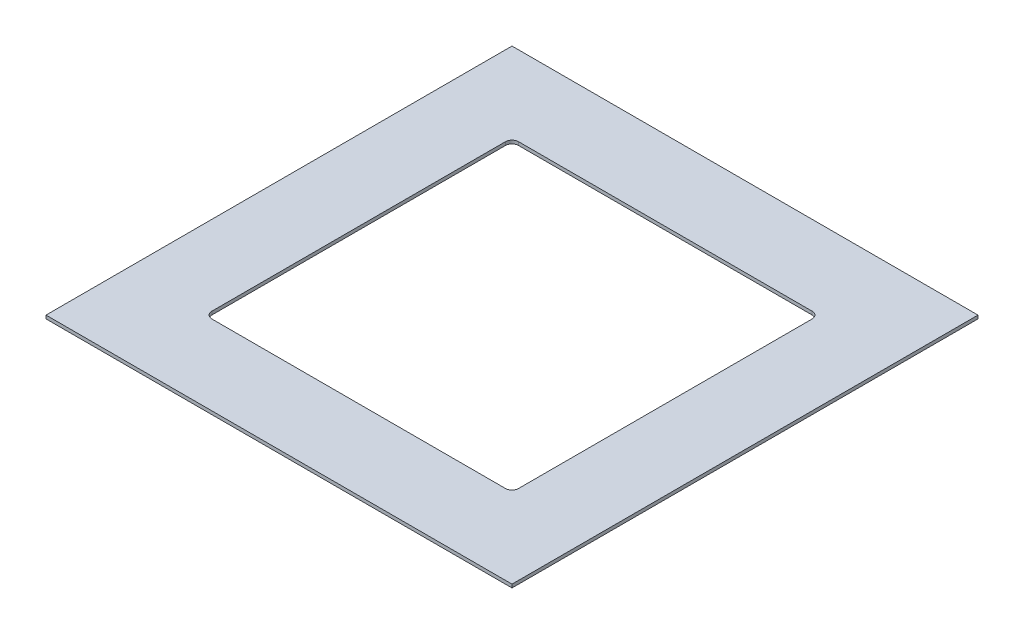
ISO-10303-21;
HEADER;
FILE_DESCRIPTION(('STEP AP214'),'2;1');
FILE_NAME('part.step','',(''),(''),'','','');
FILE_SCHEMA(('AUTOMOTIVE_DESIGN { 1 0 10303 214 1 1 1 1 }'));
ENDSEC;
DATA;
#1=APPLICATION_CONTEXT('core data for automotive mechanical design processes');
#2=APPLICATION_PROTOCOL_DEFINITION('international standard','automotive_design',2000,#1);
#3=PRODUCT_CONTEXT('',#1,'mechanical');
#4=PRODUCT('Part','Part','',(#3));
#5=PRODUCT_RELATED_PRODUCT_CATEGORY('part','',(#4));
#6=PRODUCT_DEFINITION_FORMATION('','',#4);
#7=PRODUCT_DEFINITION_CONTEXT('part definition',#1,'design');
#8=PRODUCT_DEFINITION('design','',#6,#7);
#9=PRODUCT_DEFINITION_SHAPE('','',#8);
#10=(LENGTH_UNIT() NAMED_UNIT(*) SI_UNIT(.MILLI.,.METRE.));
#11=(NAMED_UNIT(*) PLANE_ANGLE_UNIT() SI_UNIT($,.RADIAN.));
#12=(NAMED_UNIT(*) SI_UNIT($,.STERADIAN.) SOLID_ANGLE_UNIT());
#13=UNCERTAINTY_MEASURE_WITH_UNIT(LENGTH_MEASURE(1.E-05),#10,'distance_accuracy_value','');
#14=(GEOMETRIC_REPRESENTATION_CONTEXT(3) GLOBAL_UNCERTAINTY_ASSIGNED_CONTEXT((#13)) GLOBAL_UNIT_ASSIGNED_CONTEXT((#10,
#11,#12)) REPRESENTATION_CONTEXT('',''));
#15=CARTESIAN_POINT('',(0.,0.,0.));
#16=DIRECTION('',(0.,0.,1.));
#17=DIRECTION('',(1.,0.,0.));
#18=AXIS2_PLACEMENT_3D('',#15,#16,#17);
#19=CARTESIAN_POINT('',(0.,0.5,0.));
#20=DIRECTION('',(0.,-1.,0.));
#21=DIRECTION('',(0.,0.,-1.));
#22=AXIS2_PLACEMENT_3D('',#19,#20,#21);
#23=PLANE('',#22);
#24=DIRECTION('',(0.,0.,-1.));
#25=VECTOR('',#24,1.);
#26=CARTESIAN_POINT('',(69.85,0.5,69.85));
#27=LINE('',#26,#25);
#28=CARTESIAN_POINT('',(69.85,0.5,69.85));
#29=VERTEX_POINT('',#28);
#30=CARTESIAN_POINT('',(69.85,0.5,-69.85));
#31=VERTEX_POINT('',#30);
#32=EDGE_CURVE('E133',#29,#31,#27,.T.);
#33=ORIENTED_EDGE('',*,*,#32,.T.);
#34=DIRECTION('',(-1.,0.,0.));
#35=VECTOR('',#34,1.);
#36=CARTESIAN_POINT('',(-69.85,0.5,-69.85));
#37=LINE('',#36,#35);
#38=CARTESIAN_POINT('',(-69.85,0.5,-69.85));
#39=VERTEX_POINT('',#38);
#40=EDGE_CURVE('E122',#31,#39,#37,.T.);
#41=ORIENTED_EDGE('',*,*,#40,.T.);
#42=DIRECTION('',(0.,0.,1.));
#43=VECTOR('',#42,1.);
#44=CARTESIAN_POINT('',(-69.85,0.5,69.85));
#45=LINE('',#44,#43);
#46=CARTESIAN_POINT('',(-69.85,0.5,69.85));
#47=VERTEX_POINT('',#46);
#48=EDGE_CURVE('E132',#39,#47,#45,.T.);
#49=ORIENTED_EDGE('',*,*,#48,.T.);
#50=DIRECTION('',(1.,0.,0.));
#51=VECTOR('',#50,1.);
#52=CARTESIAN_POINT('',(-69.85,0.5,69.85));
#53=LINE('',#52,#51);
#54=EDGE_CURVE('E137',#47,#29,#53,.T.);
#55=ORIENTED_EDGE('',*,*,#54,.T.);
#56=EDGE_LOOP('',(#33,#41,#49,#55));
#57=FACE_BOUND('',#56,.T.);
#58=DIRECTION('',(0.,0.,-1.));
#59=VECTOR('',#58,1.);
#60=CARTESIAN_POINT('',(46.,0.5,46.));
#61=LINE('',#60,#59);
#62=CARTESIAN_POINT('',(46.,0.5,44.));
#63=VERTEX_POINT('',#62);
#64=CARTESIAN_POINT('',(46.,0.5,-44.));
#65=VERTEX_POINT('',#64);
#66=EDGE_CURVE('E201',#63,#65,#61,.T.);
#67=ORIENTED_EDGE('',*,*,#66,.F.);
#68=CARTESIAN_POINT('',(44.,0.5,44.));
#69=DIRECTION('',(0.,-1.,0.));
#70=DIRECTION('',(0.,0.,-1.));
#71=AXIS2_PLACEMENT_3D('',#68,#69,#70);
#72=CIRCLE('',#71,2.);
#73=CARTESIAN_POINT('',(44.,0.5,46.));
#74=VERTEX_POINT('',#73);
#75=EDGE_CURVE('E176',#63,#74,#72,.T.);
#76=ORIENTED_EDGE('',*,*,#75,.T.);
#77=DIRECTION('',(1.,0.,0.));
#78=VECTOR('',#77,1.);
#79=CARTESIAN_POINT('',(-46.,0.5,46.));
#80=LINE('',#79,#78);
#81=CARTESIAN_POINT('',(-44.,0.5,46.));
#82=VERTEX_POINT('',#81);
#83=EDGE_CURVE('E203',#82,#74,#80,.T.);
#84=ORIENTED_EDGE('',*,*,#83,.F.);
#85=CARTESIAN_POINT('',(-44.,0.5,44.));
#86=DIRECTION('',(0.,-1.,0.));
#87=DIRECTION('',(0.,0.,-1.));
#88=AXIS2_PLACEMENT_3D('',#85,#86,#87);
#89=CIRCLE('',#88,2.);
#90=CARTESIAN_POINT('',(-46.,0.5,44.));
#91=VERTEX_POINT('',#90);
#92=EDGE_CURVE('E172',#82,#91,#89,.T.);
#93=ORIENTED_EDGE('',*,*,#92,.T.);
#94=DIRECTION('',(0.,0.,1.));
#95=VECTOR('',#94,1.);
#96=CARTESIAN_POINT('',(-46.,0.5,46.));
#97=LINE('',#96,#95);
#98=CARTESIAN_POINT('',(-46.,0.5,-44.));
#99=VERTEX_POINT('',#98);
#100=EDGE_CURVE('E200',#99,#91,#97,.T.);
#101=ORIENTED_EDGE('',*,*,#100,.F.);
#102=CARTESIAN_POINT('',(-44.,0.5,-44.));
#103=DIRECTION('',(0.,-1.,0.));
#104=DIRECTION('',(0.,0.,-1.));
#105=AXIS2_PLACEMENT_3D('',#102,#103,#104);
#106=CIRCLE('',#105,2.);
#107=CARTESIAN_POINT('',(-44.,0.5,-46.));
#108=VERTEX_POINT('',#107);
#109=EDGE_CURVE('E11',#99,#108,#106,.T.);
#110=ORIENTED_EDGE('',*,*,#109,.T.);
#111=DIRECTION('',(-1.,0.,0.));
#112=VECTOR('',#111,1.);
#113=CARTESIAN_POINT('',(-46.,0.5,-46.));
#114=LINE('',#113,#112);
#115=CARTESIAN_POINT('',(44.,0.5,-46.));
#116=VERTEX_POINT('',#115);
#117=EDGE_CURVE('E198',#116,#108,#114,.T.);
#118=ORIENTED_EDGE('',*,*,#117,.F.);
#119=CARTESIAN_POINT('',(44.,0.5,-44.));
#120=DIRECTION('',(0.,-1.,0.));
#121=DIRECTION('',(0.,0.,-1.));
#122=AXIS2_PLACEMENT_3D('',#119,#120,#121);
#123=CIRCLE('',#122,2.);
#124=EDGE_CURVE('E180',#116,#65,#123,.T.);
#125=ORIENTED_EDGE('',*,*,#124,.T.);
#126=EDGE_LOOP('',(#67,#76,#84,#93,#101,#110,#118,#125));
#127=FACE_BOUND('',#126,.T.);
#128=ADVANCED_FACE('F33',(#57,#127),#23,.F.);
#129=CARTESIAN_POINT('',(0.,-0.5,0.));
#130=DIRECTION('',(0.,-1.,0.));
#131=DIRECTION('',(0.,0.,-1.));
#132=AXIS2_PLACEMENT_3D('',#129,#130,#131);
#133=PLANE('',#132);
#134=DIRECTION('',(0.,0.,-1.));
#135=VECTOR('',#134,1.);
#136=CARTESIAN_POINT('',(69.85,-0.5,69.85));
#137=LINE('',#136,#135);
#138=CARTESIAN_POINT('',(69.85,-0.5,69.85));
#139=VERTEX_POINT('',#138);
#140=CARTESIAN_POINT('',(69.85,-0.5,-69.85));
#141=VERTEX_POINT('',#140);
#142=EDGE_CURVE('E145',#139,#141,#137,.T.);
#143=ORIENTED_EDGE('',*,*,#142,.F.);
#144=DIRECTION('',(1.,0.,0.));
#145=VECTOR('',#144,1.);
#146=CARTESIAN_POINT('',(-69.85,-0.5,69.85));
#147=LINE('',#146,#145);
#148=CARTESIAN_POINT('',(-69.85,-0.5,69.85));
#149=VERTEX_POINT('',#148);
#150=EDGE_CURVE('E141',#149,#139,#147,.T.);
#151=ORIENTED_EDGE('',*,*,#150,.F.);
#152=DIRECTION('',(0.,0.,1.));
#153=VECTOR('',#152,1.);
#154=CARTESIAN_POINT('',(-69.85,-0.5,69.85));
#155=LINE('',#154,#153);
#156=CARTESIAN_POINT('',(-69.85,-0.5,-69.85));
#157=VERTEX_POINT('',#156);
#158=EDGE_CURVE('E222',#157,#149,#155,.T.);
#159=ORIENTED_EDGE('',*,*,#158,.F.);
#160=DIRECTION('',(-1.,0.,0.));
#161=VECTOR('',#160,1.);
#162=CARTESIAN_POINT('',(-69.85,-0.5,-69.85));
#163=LINE('',#162,#161);
#164=EDGE_CURVE('E220',#141,#157,#163,.T.);
#165=ORIENTED_EDGE('',*,*,#164,.F.);
#166=EDGE_LOOP('',(#143,#151,#159,#165));
#167=FACE_BOUND('',#166,.T.);
#168=DIRECTION('',(0.,0.,1.));
#169=VECTOR('',#168,1.);
#170=CARTESIAN_POINT('',(-46.,-0.5,46.));
#171=LINE('',#170,#169);
#172=CARTESIAN_POINT('',(-46.,-0.5,-44.));
#173=VERTEX_POINT('',#172);
#174=CARTESIAN_POINT('',(-46.,-0.5,44.));
#175=VERTEX_POINT('',#174);
#176=EDGE_CURVE('E186',#173,#175,#171,.T.);
#177=ORIENTED_EDGE('',*,*,#176,.T.);
#178=CARTESIAN_POINT('',(-44.,-0.5,44.));
#179=DIRECTION('',(0.,-1.,0.));
#180=DIRECTION('',(0.,0.,-1.));
#181=AXIS2_PLACEMENT_3D('',#178,#179,#180);
#182=CIRCLE('',#181,2.);
#183=CARTESIAN_POINT('',(-44.,-0.5,46.));
#184=VERTEX_POINT('',#183);
#185=EDGE_CURVE('E170',#175,#184,#182,.F.);
#186=ORIENTED_EDGE('',*,*,#185,.T.);
#187=DIRECTION('',(1.,0.,0.));
#188=VECTOR('',#187,1.);
#189=CARTESIAN_POINT('',(-46.,-0.5,46.));
#190=LINE('',#189,#188);
#191=CARTESIAN_POINT('',(44.,-0.5,46.));
#192=VERTEX_POINT('',#191);
#193=EDGE_CURVE('E195',#184,#192,#190,.T.);
#194=ORIENTED_EDGE('',*,*,#193,.T.);
#195=CARTESIAN_POINT('',(44.,-0.5,44.));
#196=DIRECTION('',(0.,-1.,0.));
#197=DIRECTION('',(0.,0.,-1.));
#198=AXIS2_PLACEMENT_3D('',#195,#196,#197);
#199=CIRCLE('',#198,2.);
#200=CARTESIAN_POINT('',(46.,-0.5,44.));
#201=VERTEX_POINT('',#200);
#202=EDGE_CURVE('E174',#192,#201,#199,.F.);
#203=ORIENTED_EDGE('',*,*,#202,.T.);
#204=DIRECTION('',(0.,0.,-1.));
#205=VECTOR('',#204,1.);
#206=CARTESIAN_POINT('',(46.,-0.5,46.));
#207=LINE('',#206,#205);
#208=CARTESIAN_POINT('',(46.,-0.5,-44.));
#209=VERTEX_POINT('',#208);
#210=EDGE_CURVE('E210',#201,#209,#207,.T.);
#211=ORIENTED_EDGE('',*,*,#210,.T.);
#212=CARTESIAN_POINT('',(44.,-0.5,-44.));
#213=DIRECTION('',(0.,-1.,0.));
#214=DIRECTION('',(0.,0.,-1.));
#215=AXIS2_PLACEMENT_3D('',#212,#213,#214);
#216=CIRCLE('',#215,2.);
#217=CARTESIAN_POINT('',(44.,-0.5,-46.));
#218=VERTEX_POINT('',#217);
#219=EDGE_CURVE('E178',#209,#218,#216,.F.);
#220=ORIENTED_EDGE('',*,*,#219,.T.);
#221=DIRECTION('',(-1.,0.,0.));
#222=VECTOR('',#221,1.);
#223=CARTESIAN_POINT('',(-46.,-0.5,-46.));
#224=LINE('',#223,#222);
#225=CARTESIAN_POINT('',(-44.,-0.5,-46.));
#226=VERTEX_POINT('',#225);
#227=EDGE_CURVE('E187',#218,#226,#224,.T.);
#228=ORIENTED_EDGE('',*,*,#227,.T.);
#229=CARTESIAN_POINT('',(-44.,-0.5,-44.));
#230=DIRECTION('',(0.,-1.,0.));
#231=DIRECTION('',(0.,0.,-1.));
#232=AXIS2_PLACEMENT_3D('',#229,#230,#231);
#233=CIRCLE('',#232,2.);
#234=EDGE_CURVE('E41',#226,#173,#233,.F.);
#235=ORIENTED_EDGE('',*,*,#234,.T.);
#236=EDGE_LOOP('',(#177,#186,#194,#203,#211,#220,#228,#235));
#237=FACE_BOUND('',#236,.T.);
#238=ADVANCED_FACE('F185',(#167,#237),#133,.T.);
#239=CARTESIAN_POINT('',(69.85,0.5,69.85));
#240=DIRECTION('',(-1.,0.,0.));
#241=DIRECTION('',(0.,0.,1.));
#242=AXIS2_PLACEMENT_3D('',#239,#240,#241);
#243=PLANE('',#242);
#244=ORIENTED_EDGE('',*,*,#142,.T.);
#245=DIRECTION('',(0.,-1.,0.));
#246=VECTOR('',#245,1.);
#247=CARTESIAN_POINT('',(69.85,0.5,-69.85));
#248=LINE('',#247,#246);
#249=EDGE_CURVE('E126',#31,#141,#248,.T.);
#250=ORIENTED_EDGE('',*,*,#249,.F.);
#251=ORIENTED_EDGE('',*,*,#32,.F.);
#252=DIRECTION('',(0.,-1.,0.));
#253=VECTOR('',#252,1.);
#254=CARTESIAN_POINT('',(69.85,0.5,69.85));
#255=LINE('',#254,#253);
#256=EDGE_CURVE('E218',#29,#139,#255,.T.);
#257=ORIENTED_EDGE('',*,*,#256,.T.);
#258=EDGE_LOOP('',(#244,#250,#251,#257));
#259=FACE_BOUND('',#258,.T.);
#260=ADVANCED_FACE('F143',(#259),#243,.F.);
#261=CARTESIAN_POINT('',(-69.85,0.5,-69.85));
#262=DIRECTION('',(0.,0.,1.));
#263=DIRECTION('',(1.,0.,0.));
#264=AXIS2_PLACEMENT_3D('',#261,#262,#263);
#265=PLANE('',#264);
#266=ORIENTED_EDGE('',*,*,#164,.T.);
#267=DIRECTION('',(0.,-1.,0.));
#268=VECTOR('',#267,1.);
#269=CARTESIAN_POINT('',(-69.85,0.5,-69.85));
#270=LINE('',#269,#268);
#271=EDGE_CURVE('E129',#39,#157,#270,.T.);
#272=ORIENTED_EDGE('',*,*,#271,.F.);
#273=ORIENTED_EDGE('',*,*,#40,.F.);
#274=ORIENTED_EDGE('',*,*,#249,.T.);
#275=EDGE_LOOP('',(#266,#272,#273,#274));
#276=FACE_BOUND('',#275,.T.);
#277=ADVANCED_FACE('F124',(#276),#265,.F.);
#278=CARTESIAN_POINT('',(-69.85,0.5,69.85));
#279=DIRECTION('',(1.,0.,0.));
#280=DIRECTION('',(0.,0.,-1.));
#281=AXIS2_PLACEMENT_3D('',#278,#279,#280);
#282=PLANE('',#281);
#283=ORIENTED_EDGE('',*,*,#158,.T.);
#284=DIRECTION('',(0.,-1.,0.));
#285=VECTOR('',#284,1.);
#286=CARTESIAN_POINT('',(-69.85,0.5,69.85));
#287=LINE('',#286,#285);
#288=EDGE_CURVE('E150',#47,#149,#287,.T.);
#289=ORIENTED_EDGE('',*,*,#288,.F.);
#290=ORIENTED_EDGE('',*,*,#48,.F.);
#291=ORIENTED_EDGE('',*,*,#271,.T.);
#292=EDGE_LOOP('',(#283,#289,#290,#291));
#293=FACE_BOUND('',#292,.T.);
#294=ADVANCED_FACE('F233',(#293),#282,.F.);
#295=CARTESIAN_POINT('',(-69.85,0.5,69.85));
#296=DIRECTION('',(0.,0.,-1.));
#297=DIRECTION('',(-1.,0.,0.));
#298=AXIS2_PLACEMENT_3D('',#295,#296,#297);
#299=PLANE('',#298);
#300=ORIENTED_EDGE('',*,*,#150,.T.);
#301=ORIENTED_EDGE('',*,*,#256,.F.);
#302=ORIENTED_EDGE('',*,*,#54,.F.);
#303=ORIENTED_EDGE('',*,*,#288,.T.);
#304=EDGE_LOOP('',(#300,#301,#302,#303));
#305=FACE_BOUND('',#304,.T.);
#306=ADVANCED_FACE('F229',(#305),#299,.F.);
#307=CARTESIAN_POINT('',(46.,0.5,46.));
#308=DIRECTION('',(-1.,0.,0.));
#309=DIRECTION('',(0.,0.,1.));
#310=AXIS2_PLACEMENT_3D('',#307,#308,#309);
#311=PLANE('',#310);
#312=ORIENTED_EDGE('',*,*,#210,.F.);
#313=DIRECTION('',(0.,-1.,0.));
#314=VECTOR('',#313,1.);
#315=CARTESIAN_POINT('',(46.,0.5,44.));
#316=LINE('',#315,#314);
#317=EDGE_CURVE('E164',#201,#63,#316,.F.);
#318=ORIENTED_EDGE('',*,*,#317,.T.);
#319=ORIENTED_EDGE('',*,*,#66,.T.);
#320=DIRECTION('',(0.,-1.,0.));
#321=VECTOR('',#320,1.);
#322=CARTESIAN_POINT('',(46.,-0.5,-44.));
#323=LINE('',#322,#321);
#324=EDGE_CURVE('E161',#65,#209,#323,.T.);
#325=ORIENTED_EDGE('',*,*,#324,.T.);
#326=EDGE_LOOP('',(#312,#318,#319,#325));
#327=FACE_BOUND('',#326,.T.);
#328=ADVANCED_FACE('F240',(#327),#311,.T.);
#329=CARTESIAN_POINT('',(-46.,0.5,-46.));
#330=DIRECTION('',(0.,0.,1.));
#331=DIRECTION('',(1.,0.,0.));
#332=AXIS2_PLACEMENT_3D('',#329,#330,#331);
#333=PLANE('',#332);
#334=ORIENTED_EDGE('',*,*,#227,.F.);
#335=DIRECTION('',(0.,-1.,0.));
#336=VECTOR('',#335,1.);
#337=CARTESIAN_POINT('',(44.,0.5,-46.));
#338=LINE('',#337,#336);
#339=EDGE_CURVE('E53',#218,#116,#338,.F.);
#340=ORIENTED_EDGE('',*,*,#339,.T.);
#341=ORIENTED_EDGE('',*,*,#117,.T.);
#342=DIRECTION('',(0.,-1.,0.));
#343=VECTOR('',#342,1.);
#344=CARTESIAN_POINT('',(-44.,-0.5,-46.));
#345=LINE('',#344,#343);
#346=EDGE_CURVE('E166',#108,#226,#345,.T.);
#347=ORIENTED_EDGE('',*,*,#346,.T.);
#348=EDGE_LOOP('',(#334,#340,#341,#347));
#349=FACE_BOUND('',#348,.T.);
#350=ADVANCED_FACE('F197',(#349),#333,.T.);
#351=CARTESIAN_POINT('',(-46.,0.5,46.));
#352=DIRECTION('',(1.,0.,0.));
#353=DIRECTION('',(0.,0.,-1.));
#354=AXIS2_PLACEMENT_3D('',#351,#352,#353);
#355=PLANE('',#354);
#356=ORIENTED_EDGE('',*,*,#100,.T.);
#357=DIRECTION('',(0.,-1.,0.));
#358=VECTOR('',#357,1.);
#359=CARTESIAN_POINT('',(-46.,-0.5,44.));
#360=LINE('',#359,#358);
#361=EDGE_CURVE('E148',#91,#175,#360,.T.);
#362=ORIENTED_EDGE('',*,*,#361,.T.);
#363=ORIENTED_EDGE('',*,*,#176,.F.);
#364=DIRECTION('',(0.,-1.,0.));
#365=VECTOR('',#364,1.);
#366=CARTESIAN_POINT('',(-46.,0.5,-44.));
#367=LINE('',#366,#365);
#368=EDGE_CURVE('E146',#173,#99,#367,.F.);
#369=ORIENTED_EDGE('',*,*,#368,.T.);
#370=EDGE_LOOP('',(#356,#362,#363,#369));
#371=FACE_BOUND('',#370,.T.);
#372=ADVANCED_FACE('F193',(#371),#355,.T.);
#373=CARTESIAN_POINT('',(-46.,0.5,46.));
#374=DIRECTION('',(0.,0.,-1.));
#375=DIRECTION('',(-1.,0.,0.));
#376=AXIS2_PLACEMENT_3D('',#373,#374,#375);
#377=PLANE('',#376);
#378=ORIENTED_EDGE('',*,*,#193,.F.);
#379=DIRECTION('',(0.,-1.,0.));
#380=VECTOR('',#379,1.);
#381=CARTESIAN_POINT('',(-44.,0.5,46.));
#382=LINE('',#381,#380);
#383=EDGE_CURVE('E159',#184,#82,#382,.F.);
#384=ORIENTED_EDGE('',*,*,#383,.T.);
#385=ORIENTED_EDGE('',*,*,#83,.T.);
#386=DIRECTION('',(0.,-1.,0.));
#387=VECTOR('',#386,1.);
#388=CARTESIAN_POINT('',(44.,-0.5,46.));
#389=LINE('',#388,#387);
#390=EDGE_CURVE('E156',#74,#192,#389,.T.);
#391=ORIENTED_EDGE('',*,*,#390,.T.);
#392=EDGE_LOOP('',(#378,#384,#385,#391));
#393=FACE_BOUND('',#392,.T.);
#394=ADVANCED_FACE('F257',(#393),#377,.T.);
#395=CARTESIAN_POINT('',(-44.,0.5,44.));
#396=DIRECTION('',(0.,1.,0.));
#397=DIRECTION('',(0.,0.,1.));
#398=AXIS2_PLACEMENT_3D('',#395,#396,#397);
#399=CYLINDRICAL_SURFACE('',#398,2.);
#400=ORIENTED_EDGE('',*,*,#92,.F.);
#401=ORIENTED_EDGE('',*,*,#383,.F.);
#402=ORIENTED_EDGE('',*,*,#185,.F.);
#403=ORIENTED_EDGE('',*,*,#361,.F.);
#404=EDGE_LOOP('',(#400,#401,#402,#403));
#405=FACE_BOUND('',#404,.T.);
#406=ADVANCED_FACE('F259',(#405),#399,.F.);
#407=CARTESIAN_POINT('',(44.,0.5,44.));
#408=DIRECTION('',(0.,1.,0.));
#409=DIRECTION('',(0.,0.,1.));
#410=AXIS2_PLACEMENT_3D('',#407,#408,#409);
#411=CYLINDRICAL_SURFACE('',#410,2.);
#412=ORIENTED_EDGE('',*,*,#75,.F.);
#413=ORIENTED_EDGE('',*,*,#317,.F.);
#414=ORIENTED_EDGE('',*,*,#202,.F.);
#415=ORIENTED_EDGE('',*,*,#390,.F.);
#416=EDGE_LOOP('',(#412,#413,#414,#415));
#417=FACE_BOUND('',#416,.T.);
#418=ADVANCED_FACE('F264',(#417),#411,.F.);
#419=CARTESIAN_POINT('',(44.,0.5,-44.));
#420=DIRECTION('',(0.,1.,0.));
#421=DIRECTION('',(0.,0.,1.));
#422=AXIS2_PLACEMENT_3D('',#419,#420,#421);
#423=CYLINDRICAL_SURFACE('',#422,2.);
#424=ORIENTED_EDGE('',*,*,#124,.F.);
#425=ORIENTED_EDGE('',*,*,#339,.F.);
#426=ORIENTED_EDGE('',*,*,#219,.F.);
#427=ORIENTED_EDGE('',*,*,#324,.F.);
#428=EDGE_LOOP('',(#424,#425,#426,#427));
#429=FACE_BOUND('',#428,.T.);
#430=ADVANCED_FACE('F279',(#429),#423,.F.);
#431=CARTESIAN_POINT('',(-44.,0.5,-44.));
#432=DIRECTION('',(0.,1.,0.));
#433=DIRECTION('',(0.,0.,1.));
#434=AXIS2_PLACEMENT_3D('',#431,#432,#433);
#435=CYLINDRICAL_SURFACE('',#434,2.);
#436=ORIENTED_EDGE('',*,*,#109,.F.);
#437=ORIENTED_EDGE('',*,*,#368,.F.);
#438=ORIENTED_EDGE('',*,*,#234,.F.);
#439=ORIENTED_EDGE('',*,*,#346,.F.);
#440=EDGE_LOOP('',(#436,#437,#438,#439));
#441=FACE_BOUND('',#440,.T.);
#442=ADVANCED_FACE('F35',(#441),#435,.F.);
#443=CLOSED_SHELL('',(#128,#238,#260,#277,#294,#306,#328,#350,#372,#394,#406,#418,#430,#442));
#444=MANIFOLD_SOLID_BREP('B2',#443);
#445=ADVANCED_BREP_SHAPE_REPRESENTATION('',(#18,#444),#14);
#446=SHAPE_DEFINITION_REPRESENTATION(#9,#445);
ENDSEC;
END-ISO-10303-21;
